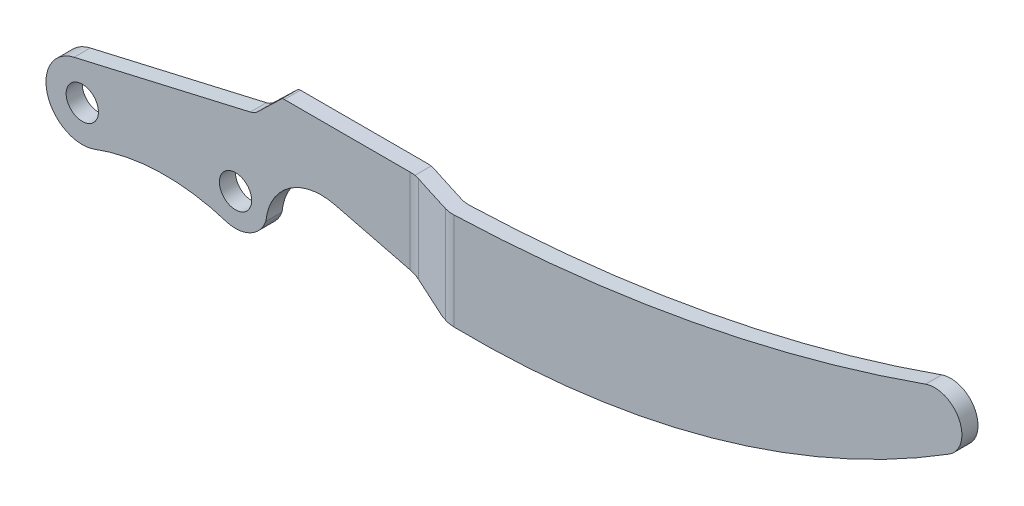
ISO-10303-21;
HEADER;
FILE_DESCRIPTION(('STEP AP214'),'2;1');
FILE_NAME('part.step','',(''),(''),'','','');
FILE_SCHEMA(('AUTOMOTIVE_DESIGN { 1 0 10303 214 1 1 1 1 }'));
ENDSEC;
DATA;
#1=APPLICATION_CONTEXT('core data for automotive mechanical design processes');
#2=APPLICATION_PROTOCOL_DEFINITION('international standard','automotive_design',2000,#1);
#3=PRODUCT_CONTEXT('',#1,'mechanical');
#4=PRODUCT('Part','Part','',(#3));
#5=PRODUCT_RELATED_PRODUCT_CATEGORY('part','',(#4));
#6=PRODUCT_DEFINITION_FORMATION('','',#4);
#7=PRODUCT_DEFINITION_CONTEXT('part definition',#1,'design');
#8=PRODUCT_DEFINITION('design','',#6,#7);
#9=PRODUCT_DEFINITION_SHAPE('','',#8);
#10=(LENGTH_UNIT() NAMED_UNIT(*) SI_UNIT(.MILLI.,.METRE.));
#11=(NAMED_UNIT(*) PLANE_ANGLE_UNIT() SI_UNIT($,.RADIAN.));
#12=(NAMED_UNIT(*) SI_UNIT($,.STERADIAN.) SOLID_ANGLE_UNIT());
#13=UNCERTAINTY_MEASURE_WITH_UNIT(LENGTH_MEASURE(1.E-05),#10,'distance_accuracy_value','');
#14=(GEOMETRIC_REPRESENTATION_CONTEXT(3) GLOBAL_UNCERTAINTY_ASSIGNED_CONTEXT((#13)) GLOBAL_UNIT_ASSIGNED_CONTEXT((#10,
#11,#12)) REPRESENTATION_CONTEXT('',''));
#15=CARTESIAN_POINT('',(0.,0.,0.));
#16=DIRECTION('',(0.,0.,1.));
#17=DIRECTION('',(1.,0.,0.));
#18=AXIS2_PLACEMENT_3D('',#15,#16,#17);
#19=CARTESIAN_POINT('',(65.5574,331.597,6.35));
#20=DIRECTION('',(0.,0.,-1.));
#21=DIRECTION('',(1.,0.,0.));
#22=AXIS2_PLACEMENT_3D('',#19,#20,#21);
#23=CYLINDRICAL_SURFACE('',#22,311.15);
#24=CARTESIAN_POINT('',(65.5574,331.597,6.35));
#25=DIRECTION('',(0.,0.,1.));
#26=DIRECTION('',(1.,0.,0.));
#27=AXIS2_PLACEMENT_3D('',#24,#25,#26);
#28=CIRCLE('',#27,311.15);
#29=CARTESIAN_POINT('',(76.3347864265922,20.6337056358388,6.35));
#30=VERTEX_POINT('',#29);
#31=CARTESIAN_POINT('',(169.14623778113,38.1968037029375,6.35));
#32=VERTEX_POINT('',#31);
#33=EDGE_CURVE('E231',#30,#32,#28,.T.);
#34=ORIENTED_EDGE('',*,*,#33,.T.);
#35=DIRECTION('',(0.,0.,-1.));
#36=VECTOR('',#35,1.);
#37=CARTESIAN_POINT('',(169.14623778113,38.1968037029375,6.35));
#38=LINE('',#37,#36);
#39=CARTESIAN_POINT('',(169.14623778113,38.1968037029375,3.175));
#40=VERTEX_POINT('',#39);
#41=EDGE_CURVE('E217',#32,#40,#38,.T.);
#42=ORIENTED_EDGE('',*,*,#41,.T.);
#43=CARTESIAN_POINT('',(65.5574,331.597,3.175));
#44=DIRECTION('',(0.,0.,-1.));
#45=DIRECTION('',(-1.,0.,0.));
#46=AXIS2_PLACEMENT_3D('',#43,#44,#45);
#47=CIRCLE('',#46,311.15);
#48=CARTESIAN_POINT('',(76.3347864265922,20.6337056358388,3.175));
#49=VERTEX_POINT('',#48);
#50=EDGE_CURVE('E371',#49,#40,#47,.F.);
#51=ORIENTED_EDGE('',*,*,#50,.F.);
#52=CARTESIAN_POINT('',(74.3725285123113,20.5718948889954,2.86420887847423));
#53=CARTESIAN_POINT('',(74.5311367317566,20.5763891986391,2.91575798428924));
#54=CARTESIAN_POINT('',(74.6917767509078,20.5810644980996,2.96103063094731));
#55=CARTESIAN_POINT('',(75.0151156051434,20.5907300263298,3.03856555023896));
#56=CARTESIAN_POINT('',(75.1777958016963,20.5957181505968,3.07090581846687));
#57=CARTESIAN_POINT('',(75.5051780191896,20.6060177710501,3.12275490258544));
#58=CARTESIAN_POINT('',(75.669880039123,20.6113292670753,3.14226372486661));
#59=CARTESIAN_POINT('',(76.00131360646,20.6222823773502,3.16843295904311));
#60=CARTESIAN_POINT('',(76.1680514060353,20.6279258244245,3.17501344269782));
#61=CARTESIAN_POINT('',(76.3347864265922,20.6337056358389,3.175));
#62=B_SPLINE_CURVE_WITH_KNOTS('',3,(#52,#53,#54,#55,#56,#57,#58,#59,#60,#61),.UNSPECIFIED.,.F.,
.F.,(4,2,2,2,4),(0.,0.500372851083115,0.997680698107768,1.49498829745572,1.99536089822942),.UNSPECIFIED.);
#63=CARTESIAN_POINT('',(74.3725285123113,20.5718948889954,2.86420887847422));
#64=VERTEX_POINT('',#63);
#65=EDGE_CURVE('E51',#64,#49,#62,.T.);
#66=ORIENTED_EDGE('',*,*,#65,.F.);
#67=CARTESIAN_POINT('',(65.5574,331.597,0.));
#68=DIRECTION('',(-0.309016994374949,0.,0.951056516295153));
#69=DIRECTION('',(-0.951056516295153,0.,-0.309016994374949));
#70=AXIS2_PLACEMENT_3D('',#67,#68,#69);
#71=ELLIPSE('',#70,327.162471071737,311.15);
#72=CARTESIAN_POINT('',(66.5139167182201,20.4484702336394,0.310791121525781));
#73=VERTEX_POINT('',#72);
#74=EDGE_CURVE('E207',#64,#73,#71,.F.);
#75=ORIENTED_EDGE('',*,*,#74,.T.);
#76=CARTESIAN_POINT('',(65.5574,20.4469999999999,0.080152741370315));
#77=CARTESIAN_POINT('',(65.719802395261,20.4470046060006,0.106222974989408));
#78=CARTESIAN_POINT('',(65.8807133194098,20.447129428471,0.138477956811886));
#79=CARTESIAN_POINT('',(66.1995522254832,20.4476195063508,0.215357416863682));
#80=CARTESIAN_POINT('',(66.3574802074077,20.4479847617603,0.259981895093025));
#81=CARTESIAN_POINT('',(66.5139167182201,20.4484702336394,0.310791121525775));
#82=B_SPLINE_CURVE_WITH_KNOTS('',3,(#76,#77,#78,#79,#80,#81),.UNSPECIFIED.,.F.,.F.,(4,2,4),(0.,
0.492335784288389,0.984671568577702),.UNSPECIFIED.);
#83=CARTESIAN_POINT('',(65.5574,20.4469999999999,0.080152741370315));
#84=VERTEX_POINT('',#83);
#85=EDGE_CURVE('E311',#84,#73,#82,.T.);
#86=ORIENTED_EDGE('',*,*,#85,.F.);
#87=DIRECTION('',(0.,0.,-1.));
#88=VECTOR('',#87,1.);
#89=CARTESIAN_POINT('',(65.5574,20.4469999999999,6.35));
#90=LINE('',#89,#88);
#91=CARTESIAN_POINT('',(65.5574,20.4469999999999,3.25515274137032));
#92=VERTEX_POINT('',#91);
#93=EDGE_CURVE('E420',#92,#84,#90,.T.);
#94=ORIENTED_EDGE('',*,*,#93,.F.);
#95=CARTESIAN_POINT('',(66.5139167182201,20.4484702336394,3.48579112152578));
#96=CARTESIAN_POINT('',(66.3574802074077,20.4479847617603,3.43498189509303));
#97=CARTESIAN_POINT('',(66.1995522254832,20.4476195063508,3.39035741686369));
#98=CARTESIAN_POINT('',(65.8807133194098,20.447129428471,3.31347795681189));
#99=CARTESIAN_POINT('',(65.719802395261,20.4470046060007,3.28122297498941));
#100=CARTESIAN_POINT('',(65.5574,20.447,3.25515274137032));
#101=B_SPLINE_CURVE_WITH_KNOTS('',3,(#95,#96,#97,#98,#99,#100),.UNSPECIFIED.,.F.,.F.,(4,2,4),
(0.,0.492335784289312,0.984671568577701),.UNSPECIFIED.);
#102=CARTESIAN_POINT('',(66.5139167182203,20.4484702336394,3.48579112152583));
#103=VERTEX_POINT('',#102);
#104=EDGE_CURVE('E325',#103,#92,#101,.T.);
#105=ORIENTED_EDGE('',*,*,#104,.F.);
#106=CARTESIAN_POINT('',(65.5574,331.597,3.175));
#107=DIRECTION('',(0.309016994374949,0.,-0.951056516295153));
#108=DIRECTION('',(-0.951056516295153,0.,-0.309016994374949));
#109=AXIS2_PLACEMENT_3D('',#106,#107,#108);
#110=ELLIPSE('',#109,327.162471071737,311.15);
#111=CARTESIAN_POINT('',(74.3725285123114,20.5718948889954,6.03920887847427));
#112=VERTEX_POINT('',#111);
#113=EDGE_CURVE('E236',#103,#112,#110,.F.);
#114=ORIENTED_EDGE('',*,*,#113,.T.);
#115=CARTESIAN_POINT('',(76.3347864265922,20.6337056358388,6.35));
#116=CARTESIAN_POINT('',(76.1680514060353,20.6279258244245,6.35001344269782));
#117=CARTESIAN_POINT('',(76.00131360646,20.6222823773501,6.3434329590431));
#118=CARTESIAN_POINT('',(75.669880039123,20.6113292670753,6.31726372486661));
#119=CARTESIAN_POINT('',(75.5051780191896,20.6060177710501,6.29775490258544));
#120=CARTESIAN_POINT('',(75.1777958016963,20.5957181505968,6.24590581846687));
#121=CARTESIAN_POINT('',(75.0151156051434,20.5907300263298,6.21356555023896));
#122=CARTESIAN_POINT('',(74.6917767509078,20.5810644980996,6.1360306309473));
#123=CARTESIAN_POINT('',(74.5311367317566,20.5763891986391,6.09075798428923));
#124=CARTESIAN_POINT('',(74.3725285123113,20.5718948889954,6.03920887847422));
#125=B_SPLINE_CURVE_WITH_KNOTS('',3,(#115,#116,#117,#118,#119,#120,#121,#122,#123,#124),
.UNSPECIFIED.,.F.,.F.,(4,2,2,2,4),(0.,0.500372600773713,0.99768020012165,1.4949880471463,
1.99536089822942),.UNSPECIFIED.);
#126=EDGE_CURVE('E318',#30,#112,#125,.T.);
#127=ORIENTED_EDGE('',*,*,#126,.F.);
#128=EDGE_LOOP('',(#34,#42,#51,#66,#75,#86,#94,#105,#114,#127));
#129=FACE_BOUND('',#128,.T.);
#130=ADVANCED_FACE('F37',(#129),#23,.F.);
#131=CARTESIAN_POINT('',(79.4512,179.2986,6.35));
#132=DIRECTION('',(0.,0.,-1.));
#133=DIRECTION('',(1.,0.,0.));
#134=AXIS2_PLACEMENT_3D('',#131,#132,#133);
#135=CYLINDRICAL_SURFACE('',#134,177.8);
#136=CARTESIAN_POINT('',(79.4512,179.2986,7.68936927552078));
#137=DIRECTION('',(0.309016994374949,0.,-0.951056516295153));
#138=DIRECTION('',(-0.951056516295153,0.,-0.309016994374949));
#139=AXIS2_PLACEMENT_3D('',#136,#137,#138);
#140=ELLIPSE('',#139,186.949983469564,177.8);
#141=CARTESIAN_POINT('',(73.2434188416669,1.6070035383489,5.6723389072748));
#142=VERTEX_POINT('',#141);
#143=CARTESIAN_POINT('',(74.3725285123113,1.57114827708763,6.03920887847426));
#144=VERTEX_POINT('',#143);
#145=EDGE_CURVE('E212',#142,#144,#140,.F.);
#146=ORIENTED_EDGE('',*,*,#145,.F.);
#147=DIRECTION('',(0.,0.,-1.));
#148=VECTOR('',#147,1.);
#149=CARTESIAN_POINT('',(73.2434188416669,1.60700353834892,6.35));
#150=LINE('',#149,#148);
#151=CARTESIAN_POINT('',(73.2434188416669,1.60700353834889,2.4973389072748));
#152=VERTEX_POINT('',#151);
#153=EDGE_CURVE('E193',#142,#152,#150,.T.);
#154=ORIENTED_EDGE('',*,*,#153,.T.);
#155=CARTESIAN_POINT('',(79.4512,179.2986,4.51436927552077));
#156=DIRECTION('',(-0.309016994374949,0.,0.951056516295153));
#157=DIRECTION('',(-0.951056516295153,0.,-0.309016994374949));
#158=AXIS2_PLACEMENT_3D('',#155,#156,#157);
#159=ELLIPSE('',#158,186.949983469564,177.8);
#160=CARTESIAN_POINT('',(74.3725285123113,1.57114827708763,2.86420887847422));
#161=VERTEX_POINT('',#160);
#162=EDGE_CURVE('E199',#161,#152,#159,.F.);
#163=ORIENTED_EDGE('',*,*,#162,.F.);
#164=CARTESIAN_POINT('',(76.3347864265922,1.52591377841113,3.175));
#165=CARTESIAN_POINT('',(76.168013016974,1.52883545019155,3.17501349528975));
#166=CARTESIAN_POINT('',(76.0012461249984,1.53199560545877,3.16842994819395));
#167=CARTESIAN_POINT('',(75.6697745052972,1.5387396193517,3.14225309133653));
#168=CARTESIAN_POINT('',(75.5050634030823,1.54232076179122,3.12273978265248));
#169=CARTESIAN_POINT('',(75.1776827538656,1.54989011611441,3.0708848800645));
#170=CARTESIAN_POINT('',(75.0150132055724,1.55387832774057,3.03854329427589));
#171=CARTESIAN_POINT('',(74.6917127829419,1.5622397813362,2.9610129739673));
#172=CARTESIAN_POINT('',(74.5311006722111,1.56661524648002,2.91574622732488));
#173=CARTESIAN_POINT('',(74.3725285123113,1.57114827708762,2.86420887847423));
#174=B_SPLINE_CURVE_WITH_KNOTS('',3,(#164,#165,#166,#167,#168,#169,#170,#171,#172,#173),
.UNSPECIFIED.,.F.,.F.,(4,2,2,2,4),(0.,0.500263265291197,0.997459769897098,1.4946559599708,
1.99491890885084),.UNSPECIFIED.);
#175=CARTESIAN_POINT('',(76.3347864265922,1.52591377841113,3.175));
#176=VERTEX_POINT('',#175);
#177=EDGE_CURVE('E11',#176,#161,#174,.T.);
#178=ORIENTED_EDGE('',*,*,#177,.F.);
#179=CARTESIAN_POINT('',(79.4512,179.2986,3.175));
#180=DIRECTION('',(0.,0.,-1.));
#181=DIRECTION('',(-1.,0.,0.));
#182=AXIS2_PLACEMENT_3D('',#179,#180,#181);
#183=CIRCLE('',#182,177.8);
#184=CARTESIAN_POINT('',(173.781330242433,28.5847435419897,3.175));
#185=VERTEX_POINT('',#184);
#186=EDGE_CURVE('E237',#176,#185,#183,.F.);
#187=ORIENTED_EDGE('',*,*,#186,.T.);
#188=DIRECTION('',(0.,0.,-1.));
#189=VECTOR('',#188,1.);
#190=CARTESIAN_POINT('',(173.781330242433,28.5847435419897,6.35));
#191=LINE('',#190,#189);
#192=CARTESIAN_POINT('',(173.781330242433,28.5847435419897,6.35));
#193=VERTEX_POINT('',#192);
#194=EDGE_CURVE('E213',#193,#185,#191,.T.);
#195=ORIENTED_EDGE('',*,*,#194,.F.);
#196=CARTESIAN_POINT('',(79.4512,179.2986,6.35));
#197=DIRECTION('',(0.,0.,1.));
#198=DIRECTION('',(1.,0.,0.));
#199=AXIS2_PLACEMENT_3D('',#196,#197,#198);
#200=CIRCLE('',#199,177.8);
#201=CARTESIAN_POINT('',(76.3347864265922,1.52591377841113,6.35));
#202=VERTEX_POINT('',#201);
#203=EDGE_CURVE('E375',#202,#193,#200,.T.);
#204=ORIENTED_EDGE('',*,*,#203,.F.);
#205=CARTESIAN_POINT('',(74.3725285123113,1.57114827708763,6.03920887847422));
#206=CARTESIAN_POINT('',(74.5311006722111,1.56661524648002,6.09074622732488));
#207=CARTESIAN_POINT('',(74.6917127829419,1.5622397813362,6.1360129739673));
#208=CARTESIAN_POINT('',(75.0150132055724,1.55387832774057,6.21354329427589));
#209=CARTESIAN_POINT('',(75.1776827538656,1.54989011611441,6.2458848800645));
#210=CARTESIAN_POINT('',(75.5050634030823,1.54232076179122,6.29773978265248));
#211=CARTESIAN_POINT('',(75.6697745052972,1.5387396193517,6.31725309133653));
#212=CARTESIAN_POINT('',(76.0012461249984,1.53199560545876,6.34342994819396));
#213=CARTESIAN_POINT('',(76.168013016974,1.52883545019154,6.35001349528975));
#214=CARTESIAN_POINT('',(76.3347864265922,1.52591377841112,6.35));
#215=B_SPLINE_CURVE_WITH_KNOTS('',3,(#205,#206,#207,#208,#209,#210,#211,#212,#213,#214),
.UNSPECIFIED.,.F.,.F.,(4,2,2,2,4),(0.,0.500262948880068,0.997459138953772,1.49465564355967,
1.99491890885087),.UNSPECIFIED.);
#216=EDGE_CURVE('E245',#144,#202,#215,.T.);
#217=ORIENTED_EDGE('',*,*,#216,.F.);
#218=EDGE_LOOP('',(#146,#154,#163,#178,#187,#195,#204,#217));
#219=FACE_BOUND('',#218,.T.);
#220=ADVANCED_FACE('F209',(#219),#135,.T.);
#221=CARTESIAN_POINT('',(4.66388047260626,18.7058028758166,6.35));
#222=DIRECTION('',(-0.241921895599701,-0.970295726275988,0.));
#223=DIRECTION('',(0.970295726275988,-0.241921895599701,0.));
#224=AXIS2_PLACEMENT_3D('',#221,#222,#223);
#225=PLANE('',#224);
#226=DIRECTION('',(-0.925395601044284,0.23072703704827,-0.300679257586578));
#227=VECTOR('',#226,1.);
#228=CARTESIAN_POINT('',(11.9360128724319,16.8926566281566,-17.4226448170766));
#229=LINE('',#228,#227);
#230=CARTESIAN_POINT('',(66.5139167182201,3.28485686291706,0.310791121525777));
#231=VERTEX_POINT('',#230);
#232=EDGE_CURVE('E188',#152,#231,#229,.T.);
#233=ORIENTED_EDGE('',*,*,#232,.F.);
#234=ORIENTED_EDGE('',*,*,#153,.F.);
#235=DIRECTION('',(0.925395601044283,-0.23072703704827,0.300679257586578));
#236=VECTOR('',#235,1.);
#237=CARTESIAN_POINT('',(11.0525778146424,17.1129217267569,-14.534690267695));
#238=LINE('',#237,#236);
#239=CARTESIAN_POINT('',(66.5139167182201,3.28485686291707,3.48579112152577));
#240=VERTEX_POINT('',#239);
#241=EDGE_CURVE('E438',#240,#142,#238,.T.);
#242=ORIENTED_EDGE('',*,*,#241,.F.);
#243=CARTESIAN_POINT('',(64.5516588039392,3.77410270974803,9.525));
#244=DIRECTION('',(0.241921895599701,0.970295726275988,0.));
#245=DIRECTION('',(-0.970295726275988,0.241921895599701,0.));
#246=AXIS2_PLACEMENT_3D('',#243,#244,#245);
#247=ELLIPSE('',#246,6.54439654637191,6.35);
#248=CARTESIAN_POINT('',(64.5516588039392,3.77410270974802,3.175));
#249=VERTEX_POINT('',#248);
#250=EDGE_CURVE('E348',#249,#240,#247,.F.);
#251=ORIENTED_EDGE('',*,*,#250,.F.);
#252=DIRECTION('',(-0.970295726275988,0.241921895599701,0.));
#253=VECTOR('',#252,1.);
#254=CARTESIAN_POINT('',(4.66388047260626,18.7058028758166,3.175));
#255=LINE('',#254,#253);
#256=CARTESIAN_POINT('',(49.7207605760364,7.47186094528204,3.175));
#257=VERTEX_POINT('',#256);
#258=EDGE_CURVE('E448',#249,#257,#255,.T.);
#259=ORIENTED_EDGE('',*,*,#258,.T.);
#260=DIRECTION('',(0.,0.,-1.));
#261=VECTOR('',#260,1.);
#262=CARTESIAN_POINT('',(49.7207605760364,7.47186094528203,6.35));
#263=LINE('',#262,#261);
#264=CARTESIAN_POINT('',(49.7207605760364,7.47186094528203,0.));
#265=VERTEX_POINT('',#264);
#266=EDGE_CURVE('E214',#257,#265,#263,.T.);
#267=ORIENTED_EDGE('',*,*,#266,.T.);
#268=DIRECTION('',(0.970295726275988,-0.241921895599701,0.));
#269=VECTOR('',#268,1.);
#270=CARTESIAN_POINT('',(4.66388047260626,18.7058028758166,0.));
#271=LINE('',#270,#269);
#272=CARTESIAN_POINT('',(64.5516588039392,3.77410270974802,0.));
#273=VERTEX_POINT('',#272);
#274=EDGE_CURVE('E396',#265,#273,#271,.T.);
#275=ORIENTED_EDGE('',*,*,#274,.T.);
#276=CARTESIAN_POINT('',(64.5516588039392,3.77410270974802,6.35));
#277=DIRECTION('',(0.241921895599701,0.970295726275988,0.));
#278=DIRECTION('',(-0.970295726275988,0.241921895599701,0.));
#279=AXIS2_PLACEMENT_3D('',#276,#277,#278);
#280=ELLIPSE('',#279,6.54439654637191,6.35);
#281=EDGE_CURVE('E197',#231,#273,#280,.T.);
#282=ORIENTED_EDGE('',*,*,#281,.F.);
#283=EDGE_LOOP('',(#233,#234,#242,#251,#259,#267,#275,#282));
#284=FACE_BOUND('',#283,.T.);
#285=ADVANCED_FACE('F190',(#284),#225,.T.);
#286=CARTESIAN_POINT('',(0.,0.,6.35));
#287=DIRECTION('',(0.,0.,-1.));
#288=DIRECTION('',(1.,0.,0.));
#289=AXIS2_PLACEMENT_3D('',#286,#287,#288);
#290=PLANE('',#289);
#291=ORIENTED_EDGE('',*,*,#203,.T.);
#292=CARTESIAN_POINT('',(170.933374337604,33.1350014111983,6.35));
#293=DIRECTION('',(0.,0.,1.));
#294=DIRECTION('',(1.,0.,0.));
#295=AXIS2_PLACEMENT_3D('',#292,#293,#294);
#296=CIRCLE('',#295,5.36802566239607);
#297=EDGE_CURVE('E378',#193,#32,#296,.T.);
#298=ORIENTED_EDGE('',*,*,#297,.T.);
#299=ORIENTED_EDGE('',*,*,#33,.F.);
#300=DIRECTION('',(0.,-1.,0.));
#301=VECTOR('',#300,1.);
#302=CARTESIAN_POINT('',(76.3347864265922,20.600476788745,6.35));
#303=LINE('',#302,#301);
#304=EDGE_CURVE('E253',#202,#30,#303,.F.);
#305=ORIENTED_EDGE('',*,*,#304,.F.);
#306=EDGE_LOOP('',(#291,#298,#299,#305));
#307=FACE_BOUND('',#306,.T.);
#308=ADVANCED_FACE('F268',(#307),#290,.F.);
#309=CARTESIAN_POINT('',(0.,0.,0.));
#310=DIRECTION('',(0.,0.,-1.));
#311=DIRECTION('',(1.,0.,0.));
#312=AXIS2_PLACEMENT_3D('',#309,#310,#311);
#313=PLANE('',#312);
#314=CARTESIAN_POINT('',(0.,0.,0.));
#315=DIRECTION('',(0.,0.,1.));
#316=DIRECTION('',(1.,0.,0.));
#317=AXIS2_PLACEMENT_3D('',#314,#315,#316);
#318=CIRCLE('',#317,3.175);
#319=CARTESIAN_POINT('',(3.175,0.,0.));
#320=VERTEX_POINT('',#319);
#321=EDGE_CURVE('E409',#320,#320,#318,.T.);
#322=ORIENTED_EDGE('',*,*,#321,.T.);
#323=EDGE_LOOP('',(#322));
#324=FACE_BOUND('',#323,.T.);
#325=CARTESIAN_POINT('',(30.1625,0.,0.));
#326=DIRECTION('',(0.,0.,1.));
#327=DIRECTION('',(1.,0.,0.));
#328=AXIS2_PLACEMENT_3D('',#325,#326,#327);
#329=CIRCLE('',#328,3.175);
#330=CARTESIAN_POINT('',(33.3375,0.,0.));
#331=VERTEX_POINT('',#330);
#332=EDGE_CURVE('E379',#331,#331,#329,.T.);
#333=ORIENTED_EDGE('',*,*,#332,.T.);
#334=EDGE_LOOP('',(#333));
#335=FACE_BOUND('',#334,.T.);
#336=ORIENTED_EDGE('',*,*,#274,.F.);
#337=CARTESIAN_POINT('',(47.0662,-3.17499999999914,0.));
#338=DIRECTION('',(0.,0.,1.));
#339=DIRECTION('',(1.,0.,0.));
#340=AXIS2_PLACEMENT_3D('',#337,#338,#339);
#341=CIRCLE('',#340,10.9728);
#342=CARTESIAN_POINT('',(36.1427867655674,-2.13510426011812,0.));
#343=VERTEX_POINT('',#342);
#344=EDGE_CURVE('E393',#265,#343,#341,.T.);
#345=ORIENTED_EDGE('',*,*,#344,.T.);
#346=CARTESIAN_POINT('',(30.1625,0.,0.));
#347=DIRECTION('',(0.,0.,1.));
#348=DIRECTION('',(1.,0.,0.));
#349=AXIS2_PLACEMENT_3D('',#346,#347,#348);
#350=CIRCLE('',#349,6.34999999999961);
#351=CARTESIAN_POINT('',(28.5008073275558,-6.1287255985515,0.));
#352=VERTEX_POINT('',#351);
#353=EDGE_CURVE('E390',#352,#343,#350,.T.);
#354=ORIENTED_EDGE('',*,*,#353,.F.);
#355=CARTESIAN_POINT('',(16.2814,-43.688,0.));
#356=DIRECTION('',(0.,0.,1.));
#357=DIRECTION('',(1.,0.,0.));
#358=AXIS2_PLACEMENT_3D('',#355,#356,#357);
#359=CIRCLE('',#358,39.4970000000004);
#360=CARTESIAN_POINT('',(2.14486889486635,-6.80749705720354,0.));
#361=VERTEX_POINT('',#360);
#362=EDGE_CURVE('E387',#352,#361,#359,.T.);
#363=ORIENTED_EDGE('',*,*,#362,.T.);
#364=CARTESIAN_POINT('',(0.,0.,0.));
#365=DIRECTION('',(0.,0.,1.));
#366=DIRECTION('',(1.,0.,0.));
#367=AXIS2_PLACEMENT_3D('',#364,#365,#366);
#368=CIRCLE('',#367,7.1374);
#369=CARTESIAN_POINT('',(-1.60556565527356,6.95446890039774,0.));
#370=VERTEX_POINT('',#369);
#371=EDGE_CURVE('E384',#370,#361,#368,.T.);
#372=ORIENTED_EDGE('',*,*,#371,.F.);
#373=DIRECTION('',(0.974370064785243,0.224951054343832,0.));
#374=VECTOR('',#373,1.);
#375=CARTESIAN_POINT('',(-1.60556565527356,6.95446890039774,0.));
#376=LINE('',#375,#374);
#377=CARTESIAN_POINT('',(33.0738195975418,14.9608358430605,0.));
#378=VERTEX_POINT('',#377);
#379=EDGE_CURVE('E374',#370,#378,#376,.T.);
#380=ORIENTED_EDGE('',*,*,#379,.T.);
#381=CARTESIAN_POINT('',(32.3596,18.0544607987541,0.));
#382=DIRECTION('',(0.,0.,1.));
#383=DIRECTION('',(1.,0.,0.));
#384=AXIS2_PLACEMENT_3D('',#381,#382,#383);
#385=CIRCLE('',#384,3.175);
#386=CARTESIAN_POINT('',(34.5651403262073,15.7705569326789,0.));
#387=VERTEX_POINT('',#386);
#388=EDGE_CURVE('E406',#378,#387,#385,.T.);
#389=ORIENTED_EDGE('',*,*,#388,.T.);
#390=DIRECTION('',(0.71933980033865,0.694658370458999,0.));
#391=VECTOR('',#390,1.);
#392=CARTESIAN_POINT('',(8.79894219493491,-9.11157137214599,0.));
#393=LINE('',#392,#391);
#394=CARTESIAN_POINT('',(39.3823143638423,20.4224478271151,0.));
#395=VERTEX_POINT('',#394);
#396=EDGE_CURVE('E403',#387,#395,#393,.T.);
#397=ORIENTED_EDGE('',*,*,#396,.T.);
#398=CARTESIAN_POINT('',(39.7764,17.272,0.));
#399=DIRECTION('',(0.,0.,1.));
#400=DIRECTION('',(1.,0.,0.));
#401=AXIS2_PLACEMENT_3D('',#398,#399,#400);
#402=CIRCLE('',#401,3.17499999999999);
#403=CARTESIAN_POINT('',(39.7764,20.447,0.));
#404=VERTEX_POINT('',#403);
#405=EDGE_CURVE('E400',#404,#395,#402,.T.);
#406=ORIENTED_EDGE('',*,*,#405,.F.);
#407=DIRECTION('',(-1.,0.,0.));
#408=VECTOR('',#407,1.);
#409=CARTESIAN_POINT('',(0.,20.447,0.));
#410=LINE('',#409,#408);
#411=CARTESIAN_POINT('',(64.5516588039392,20.4469999999999,0.));
#412=VERTEX_POINT('',#411);
#413=EDGE_CURVE('E398',#412,#404,#410,.T.);
#414=ORIENTED_EDGE('',*,*,#413,.F.);
#415=DIRECTION('',(0.,1.,0.));
#416=VECTOR('',#415,1.);
#417=CARTESIAN_POINT('',(64.5516588039392,0.,0.));
#418=LINE('',#417,#416);
#419=EDGE_CURVE('E433',#273,#412,#418,.T.);
#420=ORIENTED_EDGE('',*,*,#419,.F.);
#421=EDGE_LOOP('',(#336,#345,#354,#363,#372,#380,#389,#397,#406,#414,#420));
#422=FACE_BOUND('',#421,.T.);
#423=ADVANCED_FACE('F289',(#324,#335,#422),#313,.T.);
#424=CARTESIAN_POINT('',(-1.60556565527356,6.95446890039774,6.35));
#425=DIRECTION('',(0.224951054343832,-0.974370064785243,0.));
#426=DIRECTION('',(0.974370064785243,0.224951054343832,0.));
#427=AXIS2_PLACEMENT_3D('',#424,#425,#426);
#428=PLANE('',#427);
#429=DIRECTION('',(0.,0.,-1.));
#430=VECTOR('',#429,1.);
#431=CARTESIAN_POINT('',(33.0738195975418,14.9608358430605,6.35));
#432=LINE('',#431,#430);
#433=CARTESIAN_POINT('',(33.0738195975418,14.9608358430605,3.175));
#434=VERTEX_POINT('',#433);
#435=EDGE_CURVE('E241',#434,#378,#432,.T.);
#436=ORIENTED_EDGE('',*,*,#435,.T.);
#437=ORIENTED_EDGE('',*,*,#379,.F.);
#438=DIRECTION('',(0.,0.,-1.));
#439=VECTOR('',#438,1.);
#440=CARTESIAN_POINT('',(-1.60556565527356,6.95446890039774,6.35));
#441=LINE('',#440,#439);
#442=CARTESIAN_POINT('',(-1.60556565527367,6.95446890039819,3.175));
#443=VERTEX_POINT('',#442);
#444=EDGE_CURVE('E229',#443,#370,#441,.T.);
#445=ORIENTED_EDGE('',*,*,#444,.F.);
#446=DIRECTION('',(-0.974370064785243,-0.224951054343832,0.));
#447=VECTOR('',#446,1.);
#448=CARTESIAN_POINT('',(-1.60556565527356,6.95446890039774,3.175));
#449=LINE('',#448,#447);
#450=EDGE_CURVE('E447',#434,#443,#449,.T.);
#451=ORIENTED_EDGE('',*,*,#450,.F.);
#452=EDGE_LOOP('',(#436,#437,#445,#451));
#453=FACE_BOUND('',#452,.T.);
#454=ADVANCED_FACE('F286',(#453),#428,.F.);
#455=CARTESIAN_POINT('',(32.3596,18.0544607987541,6.35));
#456=DIRECTION('',(0.,0.,-1.));
#457=DIRECTION('',(1.,0.,0.));
#458=AXIS2_PLACEMENT_3D('',#455,#456,#457);
#459=CYLINDRICAL_SURFACE('',#458,3.175);
#460=DIRECTION('',(0.,0.,-1.));
#461=VECTOR('',#460,1.);
#462=CARTESIAN_POINT('',(34.5651403262073,15.7705569326789,6.35));
#463=LINE('',#462,#461);
#464=CARTESIAN_POINT('',(34.5651403262073,15.7705569326789,3.175));
#465=VERTEX_POINT('',#464);
#466=EDGE_CURVE('E415',#465,#387,#463,.T.);
#467=ORIENTED_EDGE('',*,*,#466,.T.);
#468=ORIENTED_EDGE('',*,*,#388,.F.);
#469=ORIENTED_EDGE('',*,*,#435,.F.);
#470=CARTESIAN_POINT('',(32.3596,18.0544607987541,3.175));
#471=DIRECTION('',(0.,0.,1.));
#472=DIRECTION('',(1.,0.,0.));
#473=AXIS2_PLACEMENT_3D('',#470,#471,#472);
#474=CIRCLE('',#473,3.175);
#475=EDGE_CURVE('E459',#465,#434,#474,.F.);
#476=ORIENTED_EDGE('',*,*,#475,.F.);
#477=EDGE_LOOP('',(#467,#468,#469,#476));
#478=FACE_BOUND('',#477,.T.);
#479=ADVANCED_FACE('F288',(#478),#459,.F.);
#480=CARTESIAN_POINT('',(8.79894219493491,-9.11157137214599,6.35));
#481=DIRECTION('',(0.694658370458999,-0.719339800338649,0.));
#482=DIRECTION('',(0.71933980033865,0.694658370458999,0.));
#483=AXIS2_PLACEMENT_3D('',#480,#481,#482);
#484=PLANE('',#483);
#485=DIRECTION('',(0.,0.,-1.));
#486=VECTOR('',#485,1.);
#487=CARTESIAN_POINT('',(39.3823143638423,20.4224478271151,6.35));
#488=LINE('',#487,#486);
#489=CARTESIAN_POINT('',(39.3823143638423,20.4224478271151,3.175));
#490=VERTEX_POINT('',#489);
#491=EDGE_CURVE('E417',#490,#395,#488,.T.);
#492=ORIENTED_EDGE('',*,*,#491,.T.);
#493=ORIENTED_EDGE('',*,*,#396,.F.);
#494=ORIENTED_EDGE('',*,*,#466,.F.);
#495=DIRECTION('',(-0.71933980033865,-0.694658370458999,0.));
#496=VECTOR('',#495,1.);
#497=CARTESIAN_POINT('',(8.79894219493491,-9.11157137214599,3.175));
#498=LINE('',#497,#496);
#499=EDGE_CURVE('E366',#490,#465,#498,.T.);
#500=ORIENTED_EDGE('',*,*,#499,.F.);
#501=EDGE_LOOP('',(#492,#493,#494,#500));
#502=FACE_BOUND('',#501,.T.);
#503=ADVANCED_FACE('F295',(#502),#484,.F.);
#504=CARTESIAN_POINT('',(39.7764,17.272,6.35));
#505=DIRECTION('',(0.,0.,-1.));
#506=DIRECTION('',(1.,0.,0.));
#507=AXIS2_PLACEMENT_3D('',#504,#505,#506);
#508=CYLINDRICAL_SURFACE('',#507,3.17499999999999);
#509=CARTESIAN_POINT('',(39.7764,17.272,3.175));
#510=DIRECTION('',(0.,0.,1.));
#511=DIRECTION('',(1.,0.,0.));
#512=AXIS2_PLACEMENT_3D('',#509,#510,#511);
#513=CIRCLE('',#512,3.17499999999999);
#514=CARTESIAN_POINT('',(39.7764,20.447,3.175));
#515=VERTEX_POINT('',#514);
#516=EDGE_CURVE('E361',#490,#515,#513,.F.);
#517=ORIENTED_EDGE('',*,*,#516,.T.);
#518=DIRECTION('',(0.,0.,-1.));
#519=VECTOR('',#518,1.);
#520=CARTESIAN_POINT('',(39.7764,20.447,6.35));
#521=LINE('',#520,#519);
#522=EDGE_CURVE('E357',#515,#404,#521,.T.);
#523=ORIENTED_EDGE('',*,*,#522,.T.);
#524=ORIENTED_EDGE('',*,*,#405,.T.);
#525=ORIENTED_EDGE('',*,*,#491,.F.);
#526=EDGE_LOOP('',(#517,#523,#524,#525));
#527=FACE_BOUND('',#526,.T.);
#528=ADVANCED_FACE('F493',(#527),#508,.T.);
#529=CARTESIAN_POINT('',(0.,20.447,6.35));
#530=DIRECTION('',(0.,1.,0.));
#531=DIRECTION('',(-1.,0.,0.));
#532=AXIS2_PLACEMENT_3D('',#529,#530,#531);
#533=PLANE('',#532);
#534=ORIENTED_EDGE('',*,*,#413,.T.);
#535=ORIENTED_EDGE('',*,*,#522,.F.);
#536=DIRECTION('',(1.,0.,0.));
#537=VECTOR('',#536,1.);
#538=CARTESIAN_POINT('',(0.,20.447,3.175));
#539=LINE('',#538,#537);
#540=CARTESIAN_POINT('',(64.5516588039392,20.4469999999999,3.175));
#541=VERTEX_POINT('',#540);
#542=EDGE_CURVE('E356',#515,#541,#539,.T.);
#543=ORIENTED_EDGE('',*,*,#542,.T.);
#544=CARTESIAN_POINT('',(64.5516588039392,20.4469999999999,9.525));
#545=DIRECTION('',(0.,-1.,0.));
#546=DIRECTION('',(-1.,0.,0.));
#547=AXIS2_PLACEMENT_3D('',#544,#545,#546);
#548=CIRCLE('',#547,6.35);
#549=EDGE_CURVE('E58',#92,#541,#548,.F.);
#550=ORIENTED_EDGE('',*,*,#549,.F.);
#551=ORIENTED_EDGE('',*,*,#93,.T.);
#552=CARTESIAN_POINT('',(64.5516588039392,20.4469999999999,6.35));
#553=DIRECTION('',(0.,-1.,0.));
#554=DIRECTION('',(-1.,0.,0.));
#555=AXIS2_PLACEMENT_3D('',#552,#553,#554);
#556=CIRCLE('',#555,6.35);
#557=EDGE_CURVE('E64',#412,#84,#556,.T.);
#558=ORIENTED_EDGE('',*,*,#557,.F.);
#559=EDGE_LOOP('',(#534,#535,#543,#550,#551,#558));
#560=FACE_BOUND('',#559,.T.);
#561=ADVANCED_FACE('F307',(#560),#533,.T.);
#562=CARTESIAN_POINT('',(170.933374337604,33.1350014111983,6.35));
#563=DIRECTION('',(0.,0.,-1.));
#564=DIRECTION('',(1.,0.,0.));
#565=AXIS2_PLACEMENT_3D('',#562,#563,#564);
#566=CYLINDRICAL_SURFACE('',#565,5.36802566239607);
#567=CARTESIAN_POINT('',(170.933374337604,33.1350014111983,3.175));
#568=DIRECTION('',(0.,0.,-1.));
#569=DIRECTION('',(-1.,0.,0.));
#570=AXIS2_PLACEMENT_3D('',#567,#568,#569);
#571=CIRCLE('',#570,5.36802566239607);
#572=EDGE_CURVE('E364',#185,#40,#571,.F.);
#573=ORIENTED_EDGE('',*,*,#572,.T.);
#574=ORIENTED_EDGE('',*,*,#41,.F.);
#575=ORIENTED_EDGE('',*,*,#297,.F.);
#576=ORIENTED_EDGE('',*,*,#194,.T.);
#577=EDGE_LOOP('',(#573,#574,#575,#576));
#578=FACE_BOUND('',#577,.T.);
#579=ADVANCED_FACE('F263',(#578),#566,.T.);
#580=CARTESIAN_POINT('',(47.0662,-3.17499999999914,6.35));
#581=DIRECTION('',(0.,0.,-1.));
#582=DIRECTION('',(1.,0.,0.));
#583=AXIS2_PLACEMENT_3D('',#580,#581,#582);
#584=CYLINDRICAL_SURFACE('',#583,10.9728);
#585=DIRECTION('',(0.,0.,-1.));
#586=VECTOR('',#585,1.);
#587=CARTESIAN_POINT('',(36.1427867655674,-2.13510426011812,6.35));
#588=LINE('',#587,#586);
#589=CARTESIAN_POINT('',(36.1427867655674,-2.13510426011812,3.175));
#590=VERTEX_POINT('',#589);
#591=EDGE_CURVE('E220',#590,#343,#588,.T.);
#592=ORIENTED_EDGE('',*,*,#591,.T.);
#593=ORIENTED_EDGE('',*,*,#344,.F.);
#594=ORIENTED_EDGE('',*,*,#266,.F.);
#595=CARTESIAN_POINT('',(47.0662,-3.17499999999914,3.175));
#596=DIRECTION('',(0.,0.,1.));
#597=DIRECTION('',(1.,0.,0.));
#598=AXIS2_PLACEMENT_3D('',#595,#596,#597);
#599=CIRCLE('',#598,10.9728);
#600=EDGE_CURVE('E453',#590,#257,#599,.F.);
#601=ORIENTED_EDGE('',*,*,#600,.F.);
#602=EDGE_LOOP('',(#592,#593,#594,#601));
#603=FACE_BOUND('',#602,.T.);
#604=ADVANCED_FACE('F269',(#603),#584,.F.);
#605=CARTESIAN_POINT('',(30.1625,0.,6.35));
#606=DIRECTION('',(0.,0.,-1.));
#607=DIRECTION('',(1.,0.,0.));
#608=AXIS2_PLACEMENT_3D('',#605,#606,#607);
#609=CYLINDRICAL_SURFACE('',#608,6.34999999999961);
#610=CARTESIAN_POINT('',(30.1625,0.,3.175));
#611=DIRECTION('',(0.,0.,1.));
#612=DIRECTION('',(1.,0.,0.));
#613=AXIS2_PLACEMENT_3D('',#610,#611,#612);
#614=CIRCLE('',#613,6.34999999999961);
#615=CARTESIAN_POINT('',(28.5008073275558,-6.1287255985515,3.175));
#616=VERTEX_POINT('',#615);
#617=EDGE_CURVE('E450',#590,#616,#614,.F.);
#618=ORIENTED_EDGE('',*,*,#617,.T.);
#619=DIRECTION('',(0.,0.,-1.));
#620=VECTOR('',#619,1.);
#621=CARTESIAN_POINT('',(28.5008073275558,-6.1287255985515,6.35));
#622=LINE('',#621,#620);
#623=EDGE_CURVE('E225',#616,#352,#622,.T.);
#624=ORIENTED_EDGE('',*,*,#623,.T.);
#625=ORIENTED_EDGE('',*,*,#353,.T.);
#626=ORIENTED_EDGE('',*,*,#591,.F.);
#627=EDGE_LOOP('',(#618,#624,#625,#626));
#628=FACE_BOUND('',#627,.T.);
#629=ADVANCED_FACE('F272',(#628),#609,.T.);
#630=CARTESIAN_POINT('',(16.2814,-43.688,6.35));
#631=DIRECTION('',(0.,0.,-1.));
#632=DIRECTION('',(1.,0.,0.));
#633=AXIS2_PLACEMENT_3D('',#630,#631,#632);
#634=CYLINDRICAL_SURFACE('',#633,39.4970000000004);
#635=DIRECTION('',(0.,0.,-1.));
#636=VECTOR('',#635,1.);
#637=CARTESIAN_POINT('',(2.14486889486635,-6.80749705720354,6.35));
#638=LINE('',#637,#636);
#639=CARTESIAN_POINT('',(2.14486889486635,-6.80749705720354,3.175));
#640=VERTEX_POINT('',#639);
#641=EDGE_CURVE('E227',#640,#361,#638,.T.);
#642=ORIENTED_EDGE('',*,*,#641,.T.);
#643=ORIENTED_EDGE('',*,*,#362,.F.);
#644=ORIENTED_EDGE('',*,*,#623,.F.);
#645=CARTESIAN_POINT('',(16.2814,-43.688,3.175));
#646=DIRECTION('',(0.,0.,1.));
#647=DIRECTION('',(1.,0.,0.));
#648=AXIS2_PLACEMENT_3D('',#645,#646,#647);
#649=CIRCLE('',#648,39.4970000000004);
#650=EDGE_CURVE('E235',#640,#616,#649,.F.);
#651=ORIENTED_EDGE('',*,*,#650,.F.);
#652=EDGE_LOOP('',(#642,#643,#644,#651));
#653=FACE_BOUND('',#652,.T.);
#654=ADVANCED_FACE('F276',(#653),#634,.F.);
#655=CARTESIAN_POINT('',(0.,0.,6.35));
#656=DIRECTION('',(0.,0.,-1.));
#657=DIRECTION('',(1.,0.,0.));
#658=AXIS2_PLACEMENT_3D('',#655,#656,#657);
#659=CYLINDRICAL_SURFACE('',#658,3.175);
#660=CARTESIAN_POINT('',(0.,0.,3.175));
#661=DIRECTION('',(0.,0.,1.));
#662=DIRECTION('',(1.,0.,0.));
#663=AXIS2_PLACEMENT_3D('',#660,#661,#662);
#664=CIRCLE('',#663,3.175);
#665=CARTESIAN_POINT('',(3.175,0.,3.175));
#666=VERTEX_POINT('',#665);
#667=EDGE_CURVE('E360',#666,#666,#664,.F.);
#668=ORIENTED_EDGE('',*,*,#667,.F.);
#669=EDGE_LOOP('',(#668));
#670=FACE_BOUND('',#669,.T.);
#671=ORIENTED_EDGE('',*,*,#321,.F.);
#672=EDGE_LOOP('',(#671));
#673=FACE_BOUND('',#672,.T.);
#674=ADVANCED_FACE('F280',(#670,#673),#659,.F.);
#675=CARTESIAN_POINT('',(0.,0.,6.35));
#676=DIRECTION('',(0.,0.,-1.));
#677=DIRECTION('',(1.,0.,0.));
#678=AXIS2_PLACEMENT_3D('',#675,#676,#677);
#679=CYLINDRICAL_SURFACE('',#678,7.1374);
#680=CARTESIAN_POINT('',(0.,0.,3.175));
#681=DIRECTION('',(0.,0.,1.));
#682=DIRECTION('',(1.,0.,0.));
#683=AXIS2_PLACEMENT_3D('',#680,#681,#682);
#684=CIRCLE('',#683,7.1374);
#685=EDGE_CURVE('E445',#640,#443,#684,.F.);
#686=ORIENTED_EDGE('',*,*,#685,.T.);
#687=ORIENTED_EDGE('',*,*,#444,.T.);
#688=ORIENTED_EDGE('',*,*,#371,.T.);
#689=ORIENTED_EDGE('',*,*,#641,.F.);
#690=EDGE_LOOP('',(#686,#687,#688,#689));
#691=FACE_BOUND('',#690,.T.);
#692=ADVANCED_FACE('F282',(#691),#679,.T.);
#693=CARTESIAN_POINT('',(30.1625,0.,6.35));
#694=DIRECTION('',(0.,0.,-1.));
#695=DIRECTION('',(1.,0.,0.));
#696=AXIS2_PLACEMENT_3D('',#693,#694,#695);
#697=CYLINDRICAL_SURFACE('',#696,3.175);
#698=CARTESIAN_POINT('',(30.1625,0.,3.175));
#699=DIRECTION('',(0.,0.,1.));
#700=DIRECTION('',(1.,0.,0.));
#701=AXIS2_PLACEMENT_3D('',#698,#699,#700);
#702=CIRCLE('',#701,3.175);
#703=CARTESIAN_POINT('',(33.3375,0.,3.175));
#704=VERTEX_POINT('',#703);
#705=EDGE_CURVE('E232',#704,#704,#702,.F.);
#706=ORIENTED_EDGE('',*,*,#705,.F.);
#707=EDGE_LOOP('',(#706));
#708=FACE_BOUND('',#707,.T.);
#709=ORIENTED_EDGE('',*,*,#332,.F.);
#710=EDGE_LOOP('',(#709));
#711=FACE_BOUND('',#710,.T.);
#712=ADVANCED_FACE('F284',(#708,#711),#697,.F.);
#713=CARTESIAN_POINT('',(0.,-7.1374,3.17499999999999));
#714=DIRECTION('',(0.,0.,1.));
#715=DIRECTION('',(-1.,0.,0.));
#716=AXIS2_PLACEMENT_3D('',#713,#714,#715);
#717=PLANE('',#716);
#718=ORIENTED_EDGE('',*,*,#50,.T.);
#719=ORIENTED_EDGE('',*,*,#572,.F.);
#720=ORIENTED_EDGE('',*,*,#186,.F.);
#721=DIRECTION('',(0.,1.,0.));
#722=VECTOR('',#721,1.);
#723=CARTESIAN_POINT('',(76.3347864265922,-7.1374,3.175));
#724=LINE('',#723,#722);
#725=EDGE_CURVE('E432',#49,#176,#724,.F.);
#726=ORIENTED_EDGE('',*,*,#725,.F.);
#727=EDGE_LOOP('',(#718,#719,#720,#726));
#728=FACE_BOUND('',#727,.T.);
#729=ADVANCED_FACE('F431',(#728),#717,.F.);
#730=CARTESIAN_POINT('',(6.26017464648196,-7.1374,-19.2668364493194));
#731=DIRECTION('',(0.309016994374949,0.,-0.951056516295153));
#732=DIRECTION('',(0.951056516295153,0.,0.309016994374949));
#733=AXIS2_PLACEMENT_3D('',#730,#731,#732);
#734=PLANE('',#733);
#735=ORIENTED_EDGE('',*,*,#162,.T.);
#736=ORIENTED_EDGE('',*,*,#232,.T.);
#737=DIRECTION('',(0.,1.,0.));
#738=VECTOR('',#737,1.);
#739=CARTESIAN_POINT('',(66.5139167182201,-7.1374,0.310791121525777));
#740=LINE('',#739,#738);
#741=EDGE_CURVE('E485',#73,#231,#740,.F.);
#742=ORIENTED_EDGE('',*,*,#741,.F.);
#743=ORIENTED_EDGE('',*,*,#74,.F.);
#744=DIRECTION('',(0.,1.,0.));
#745=VECTOR('',#744,1.);
#746=CARTESIAN_POINT('',(74.3725285123113,-7.1374,2.86420887847422));
#747=LINE('',#746,#745);
#748=EDGE_CURVE('E204',#161,#64,#747,.T.);
#749=ORIENTED_EDGE('',*,*,#748,.F.);
#750=EDGE_LOOP('',(#735,#736,#742,#743,#749));
#751=FACE_BOUND('',#750,.T.);
#752=ADVANCED_FACE('F202',(#751),#734,.T.);
#753=CARTESIAN_POINT('',(0.,-7.1374,3.175));
#754=DIRECTION('',(0.,0.,-1.));
#755=DIRECTION('',(1.,0.,0.));
#756=AXIS2_PLACEMENT_3D('',#753,#754,#755);
#757=PLANE('',#756);
#758=ORIENTED_EDGE('',*,*,#705,.T.);
#759=EDGE_LOOP('',(#758));
#760=FACE_BOUND('',#759,.T.);
#761=ORIENTED_EDGE('',*,*,#542,.F.);
#762=ORIENTED_EDGE('',*,*,#516,.F.);
#763=ORIENTED_EDGE('',*,*,#499,.T.);
#764=ORIENTED_EDGE('',*,*,#475,.T.);
#765=ORIENTED_EDGE('',*,*,#450,.T.);
#766=ORIENTED_EDGE('',*,*,#685,.F.);
#767=ORIENTED_EDGE('',*,*,#650,.T.);
#768=ORIENTED_EDGE('',*,*,#617,.F.);
#769=ORIENTED_EDGE('',*,*,#600,.T.);
#770=ORIENTED_EDGE('',*,*,#258,.F.);
#771=DIRECTION('',(0.,1.,0.));
#772=VECTOR('',#771,1.);
#773=CARTESIAN_POINT('',(64.5516588039392,-7.1374,3.175));
#774=LINE('',#773,#772);
#775=EDGE_CURVE('E351',#541,#249,#774,.F.);
#776=ORIENTED_EDGE('',*,*,#775,.F.);
#777=EDGE_LOOP('',(#761,#762,#763,#764,#765,#766,#767,#768,#769,#770,#776));
#778=FACE_BOUND('',#777,.T.);
#779=ORIENTED_EDGE('',*,*,#667,.T.);
#780=EDGE_LOOP('',(#779));
#781=FACE_BOUND('',#780,.T.);
#782=ADVANCED_FACE('F462',(#760,#778,#781),#757,.F.);
#783=CARTESIAN_POINT('',(5.32706555846766,-7.1374,-16.3950219707491));
#784=DIRECTION('',(-0.309016994374949,0.,0.951056516295153));
#785=DIRECTION('',(-0.951056516295153,0.,-0.309016994374949));
#786=AXIS2_PLACEMENT_3D('',#783,#784,#785);
#787=PLANE('',#786);
#788=ORIENTED_EDGE('',*,*,#113,.F.);
#789=DIRECTION('',(0.,1.,0.));
#790=VECTOR('',#789,1.);
#791=CARTESIAN_POINT('',(66.5139167182201,-7.1374,3.48579112152578));
#792=LINE('',#791,#790);
#793=EDGE_CURVE('E240',#240,#103,#792,.T.);
#794=ORIENTED_EDGE('',*,*,#793,.F.);
#795=ORIENTED_EDGE('',*,*,#241,.T.);
#796=ORIENTED_EDGE('',*,*,#145,.T.);
#797=DIRECTION('',(0.,-1.,0.));
#798=VECTOR('',#797,1.);
#799=CARTESIAN_POINT('',(74.3725285123113,1.54639089964434,6.03920887847423));
#800=LINE('',#799,#798);
#801=EDGE_CURVE('E243',#112,#144,#800,.T.);
#802=ORIENTED_EDGE('',*,*,#801,.F.);
#803=EDGE_LOOP('',(#788,#794,#795,#796,#802));
#804=FACE_BOUND('',#803,.T.);
#805=ADVANCED_FACE('F512',(#804),#787,.T.);
#806=CARTESIAN_POINT('',(76.3347864265922,-7.1374,0.));
#807=DIRECTION('',(0.,1.,0.));
#808=DIRECTION('',(0.,0.,-1.));
#809=AXIS2_PLACEMENT_3D('',#806,#807,#808);
#810=CYLINDRICAL_SURFACE('',#809,6.35);
#811=ORIENTED_EDGE('',*,*,#126,.T.);
#812=ORIENTED_EDGE('',*,*,#801,.T.);
#813=ORIENTED_EDGE('',*,*,#216,.T.);
#814=ORIENTED_EDGE('',*,*,#304,.T.);
#815=EDGE_LOOP('',(#811,#812,#813,#814));
#816=FACE_BOUND('',#815,.T.);
#817=ADVANCED_FACE('F255',(#816),#810,.T.);
#818=CARTESIAN_POINT('',(64.5516588039392,-7.1374,9.525));
#819=DIRECTION('',(0.,1.,0.));
#820=DIRECTION('',(0.,0.,-1.));
#821=AXIS2_PLACEMENT_3D('',#818,#819,#820);
#822=CYLINDRICAL_SURFACE('',#821,6.35);
#823=ORIENTED_EDGE('',*,*,#250,.T.);
#824=ORIENTED_EDGE('',*,*,#793,.T.);
#825=ORIENTED_EDGE('',*,*,#104,.T.);
#826=ORIENTED_EDGE('',*,*,#549,.T.);
#827=ORIENTED_EDGE('',*,*,#775,.T.);
#828=EDGE_LOOP('',(#823,#824,#825,#826,#827));
#829=FACE_BOUND('',#828,.T.);
#830=ADVANCED_FACE('F334',(#829),#822,.F.);
#831=CARTESIAN_POINT('',(76.3347864265922,-7.1374,-3.175));
#832=DIRECTION('',(0.,1.,0.));
#833=DIRECTION('',(0.,0.,-1.));
#834=AXIS2_PLACEMENT_3D('',#831,#832,#833);
#835=CYLINDRICAL_SURFACE('',#834,6.35);
#836=ORIENTED_EDGE('',*,*,#177,.T.);
#837=ORIENTED_EDGE('',*,*,#748,.T.);
#838=ORIENTED_EDGE('',*,*,#65,.T.);
#839=ORIENTED_EDGE('',*,*,#725,.T.);
#840=EDGE_LOOP('',(#836,#837,#838,#839));
#841=FACE_BOUND('',#840,.T.);
#842=ADVANCED_FACE('F337',(#841),#835,.F.);
#843=CARTESIAN_POINT('',(64.5516588039392,0.,6.35));
#844=DIRECTION('',(0.,1.,0.));
#845=DIRECTION('',(0.,0.,-1.));
#846=AXIS2_PLACEMENT_3D('',#843,#844,#845);
#847=CYLINDRICAL_SURFACE('',#846,6.35);
#848=ORIENTED_EDGE('',*,*,#281,.T.);
#849=ORIENTED_EDGE('',*,*,#419,.T.);
#850=ORIENTED_EDGE('',*,*,#557,.T.);
#851=ORIENTED_EDGE('',*,*,#85,.T.);
#852=ORIENTED_EDGE('',*,*,#741,.T.);
#853=EDGE_LOOP('',(#848,#849,#850,#851,#852));
#854=FACE_BOUND('',#853,.T.);
#855=ADVANCED_FACE('F39',(#854),#847,.T.);
#856=CLOSED_SHELL('',(#130,#220,#285,#308,#423,#454,#479,#503,#528,#561,#579,#604,#629,#654,
#674,#692,#712,#729,#752,#782,#805,#817,#830,#842,#855));
#857=MANIFOLD_SOLID_BREP('B2',#856);
#858=ADVANCED_BREP_SHAPE_REPRESENTATION('',(#18,#857),#14);
#859=SHAPE_DEFINITION_REPRESENTATION(#9,#858);
ENDSEC;
END-ISO-10303-21;
